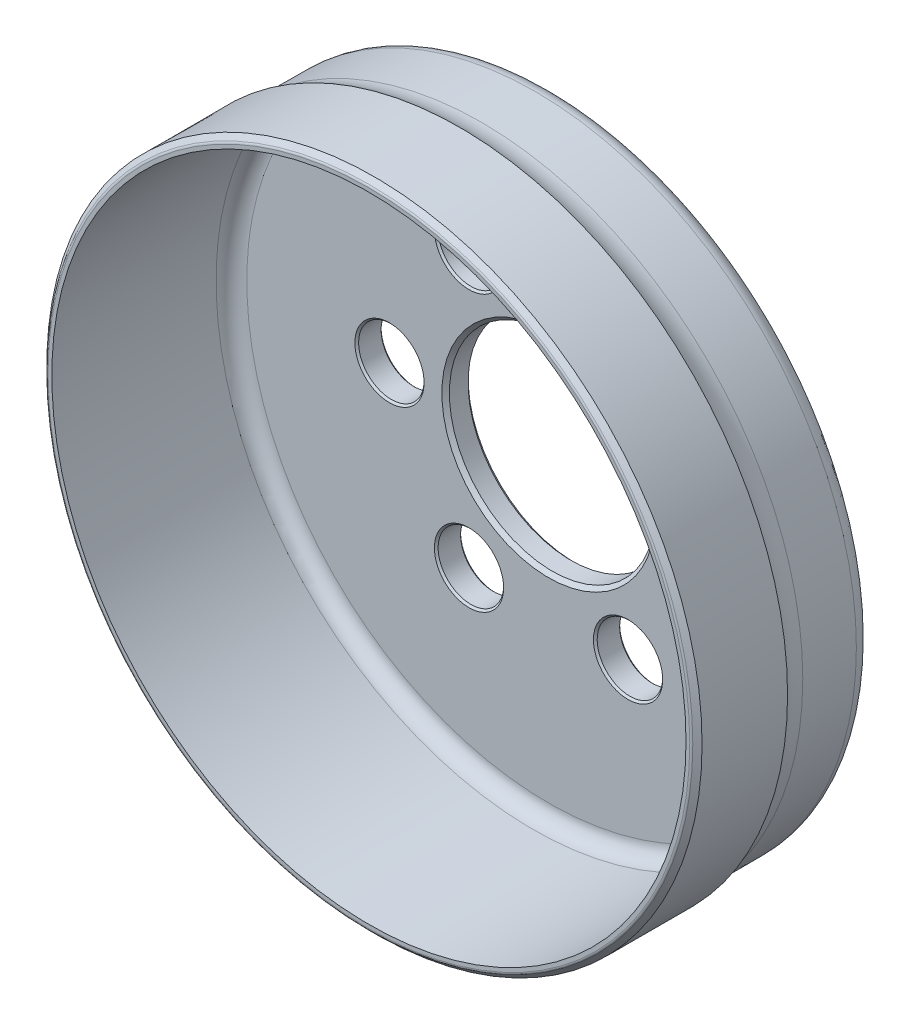
ISO-10303-21;
HEADER;
FILE_DESCRIPTION(('STEP AP214'),'2;1');
FILE_NAME('part.step','',(''),(''),'','','');
FILE_SCHEMA(('AUTOMOTIVE_DESIGN { 1 0 10303 214 1 1 1 1 }'));
ENDSEC;
DATA;
#1=APPLICATION_CONTEXT('core data for automotive mechanical design processes');
#2=APPLICATION_PROTOCOL_DEFINITION('international standard','automotive_design',2000,#1);
#3=PRODUCT_CONTEXT('',#1,'mechanical');
#4=PRODUCT('Part','Part','',(#3));
#5=PRODUCT_RELATED_PRODUCT_CATEGORY('part','',(#4));
#6=PRODUCT_DEFINITION_FORMATION('','',#4);
#7=PRODUCT_DEFINITION_CONTEXT('part definition',#1,'design');
#8=PRODUCT_DEFINITION('design','',#6,#7);
#9=PRODUCT_DEFINITION_SHAPE('','',#8);
#10=(LENGTH_UNIT() NAMED_UNIT(*) SI_UNIT(.MILLI.,.METRE.));
#11=(NAMED_UNIT(*) PLANE_ANGLE_UNIT() SI_UNIT($,.RADIAN.));
#12=(NAMED_UNIT(*) SI_UNIT($,.STERADIAN.) SOLID_ANGLE_UNIT());
#13=UNCERTAINTY_MEASURE_WITH_UNIT(LENGTH_MEASURE(1.E-05),#10,'distance_accuracy_value','');
#14=(GEOMETRIC_REPRESENTATION_CONTEXT(3) GLOBAL_UNCERTAINTY_ASSIGNED_CONTEXT((#13)) GLOBAL_UNIT_ASSIGNED_CONTEXT((#10,
#11,#12)) REPRESENTATION_CONTEXT('',''));
#15=CARTESIAN_POINT('',(0.,0.,0.));
#16=DIRECTION('',(0.,0.,1.));
#17=DIRECTION('',(1.,0.,0.));
#18=AXIS2_PLACEMENT_3D('',#15,#16,#17);
#19=CARTESIAN_POINT('',(4.25,-7.3612159321677,0.10000000000291));
#20=DIRECTION('',(0.,0.,-1.));
#21=DIRECTION('',(-0.5,0.866025403784439,0.));
#22=AXIS2_PLACEMENT_3D('',#19,#20,#21);
#23=CONICAL_SURFACE('',#22,1.75,0.785398162499991);
#24=CARTESIAN_POINT('',(4.25,-7.3612159321677,2.9072686986481E-12));
#25=DIRECTION('',(0.,0.,1.));
#26=DIRECTION('',(0.5,-0.866025403784439,0.));
#27=AXIS2_PLACEMENT_3D('',#24,#25,#26);
#28=CIRCLE('',#27,1.85);
#29=CARTESIAN_POINT('',(5.175,-8.9633629291689,2.9070773566175E-12));
#30=VERTEX_POINT('',#29);
#31=EDGE_CURVE('E258',#30,#30,#28,.T.);
#32=ORIENTED_EDGE('',*,*,#31,.F.);
#33=DIRECTION('',(-0.353553390593271,0.612372435695791,0.707106781186552));
#34=VECTOR('',#33,1.);
#35=CARTESIAN_POINT('',(5.175,-8.9633629291689,2.9070773566175E-12));
#36=LINE('',#35,#34);
#37=CARTESIAN_POINT('',(5.125,-8.8767603887905,0.10000000000291));
#38=VERTEX_POINT('',#37);
#39=EDGE_CURVE('E11',#30,#38,#36,.T.);
#40=ORIENTED_EDGE('',*,*,#39,.T.);
#41=CARTESIAN_POINT('',(4.25,-7.3612159321677,0.10000000000291));
#42=DIRECTION('',(0.,0.,1.));
#43=DIRECTION('',(0.5,-0.866025403784439,0.));
#44=AXIS2_PLACEMENT_3D('',#41,#42,#43);
#45=CIRCLE('',#44,1.75);
#46=EDGE_CURVE('E370',#38,#38,#45,.T.);
#47=ORIENTED_EDGE('',*,*,#46,.T.);
#48=ORIENTED_EDGE('',*,*,#39,.F.);
#49=EDGE_LOOP('',(#32,#40,#47,#48));
#50=FACE_BOUND('',#49,.T.);
#51=ADVANCED_FACE('F17',(#50),#23,.F.);
#52=CARTESIAN_POINT('',(-4.25,-7.3612159321677,0.1000000000029));
#53=DIRECTION('',(0.,0.,-1.));
#54=DIRECTION('',(0.5,0.866025403784439,0.));
#55=AXIS2_PLACEMENT_3D('',#52,#53,#54);
#56=CONICAL_SURFACE('',#55,1.75,0.785398162500023);
#57=CARTESIAN_POINT('',(-4.25,-7.3612159321677,2.9073045836436E-12));
#58=DIRECTION('',(0.,0.,1.));
#59=DIRECTION('',(-0.5,-0.866025403784439,0.));
#60=AXIS2_PLACEMENT_3D('',#57,#58,#59);
#61=CIRCLE('',#60,1.85);
#62=CARTESIAN_POINT('',(-5.175,-8.9633629291689,2.9070773566175E-12));
#63=VERTEX_POINT('',#62);
#64=EDGE_CURVE('E254',#63,#63,#61,.T.);
#65=ORIENTED_EDGE('',*,*,#64,.F.);
#66=DIRECTION('',(0.353553390593271,0.612372435695791,0.707106781186552));
#67=VECTOR('',#66,1.);
#68=CARTESIAN_POINT('',(-5.175,-8.9633629291689,2.9070773566175E-12));
#69=LINE('',#68,#67);
#70=CARTESIAN_POINT('',(-5.125,-8.8767603887905,0.10000000000291));
#71=VERTEX_POINT('',#70);
#72=EDGE_CURVE('E25',#63,#71,#69,.T.);
#73=ORIENTED_EDGE('',*,*,#72,.T.);
#74=CARTESIAN_POINT('',(-4.25,-7.3612159321677,0.10000000000291));
#75=DIRECTION('',(0.,0.,1.));
#76=DIRECTION('',(-0.5,-0.866025403784439,0.));
#77=AXIS2_PLACEMENT_3D('',#74,#75,#76);
#78=CIRCLE('',#77,1.75);
#79=EDGE_CURVE('E279',#71,#71,#78,.T.);
#80=ORIENTED_EDGE('',*,*,#79,.T.);
#81=ORIENTED_EDGE('',*,*,#72,.F.);
#82=EDGE_LOOP('',(#65,#73,#80,#81));
#83=FACE_BOUND('',#82,.T.);
#84=ADVANCED_FACE('F453',(#83),#56,.F.);
#85=CARTESIAN_POINT('',(-8.5,0.,0.10000000000291));
#86=DIRECTION('',(0.,0.,-1.));
#87=DIRECTION('',(1.,0.,0.));
#88=AXIS2_PLACEMENT_3D('',#85,#86,#87);
#89=CONICAL_SURFACE('',#88,1.75,0.785398162499991);
#90=CARTESIAN_POINT('',(-8.5,0.,2.9072907058558E-12));
#91=DIRECTION('',(0.,0.,1.));
#92=DIRECTION('',(-1.,0.,0.));
#93=AXIS2_PLACEMENT_3D('',#90,#91,#92);
#94=CIRCLE('',#93,1.85);
#95=CARTESIAN_POINT('',(-10.35,0.,2.9070773566175E-12));
#96=VERTEX_POINT('',#95);
#97=EDGE_CURVE('E259',#96,#96,#94,.T.);
#98=ORIENTED_EDGE('',*,*,#97,.F.);
#99=DIRECTION('',(0.707106781186548,0.,0.707106781186548));
#100=VECTOR('',#99,1.);
#101=CARTESIAN_POINT('',(-10.35,0.,2.9070773566175E-12));
#102=LINE('',#101,#100);
#103=CARTESIAN_POINT('',(-10.25,0.,0.10000000000291));
#104=VERTEX_POINT('',#103);
#105=EDGE_CURVE('E388',#96,#104,#102,.T.);
#106=ORIENTED_EDGE('',*,*,#105,.T.);
#107=CARTESIAN_POINT('',(-8.5,0.,0.10000000000291));
#108=DIRECTION('',(0.,0.,1.));
#109=DIRECTION('',(-1.,0.,0.));
#110=AXIS2_PLACEMENT_3D('',#107,#108,#109);
#111=CIRCLE('',#110,1.75);
#112=EDGE_CURVE('E314',#104,#104,#111,.T.);
#113=ORIENTED_EDGE('',*,*,#112,.T.);
#114=ORIENTED_EDGE('',*,*,#105,.F.);
#115=EDGE_LOOP('',(#98,#106,#113,#114));
#116=FACE_BOUND('',#115,.T.);
#117=ADVANCED_FACE('F458',(#116),#89,.F.);
#118=CARTESIAN_POINT('',(-4.25,7.3612159321677,0.1000000000029));
#119=DIRECTION('',(0.,0.,-1.));
#120=DIRECTION('',(0.5,-0.866025403784439,0.));
#121=AXIS2_PLACEMENT_3D('',#118,#119,#120);
#122=CONICAL_SURFACE('',#121,1.75,0.785398162500023);
#123=CARTESIAN_POINT('',(-4.25,7.3612159321677,2.9072849574879E-12));
#124=DIRECTION('',(0.,0.,1.));
#125=DIRECTION('',(-0.5,0.866025403784439,0.));
#126=AXIS2_PLACEMENT_3D('',#123,#124,#125);
#127=CIRCLE('',#126,1.85);
#128=CARTESIAN_POINT('',(-5.175,8.9633629291689,2.9070773566175E-12));
#129=VERTEX_POINT('',#128);
#130=EDGE_CURVE('E336',#129,#129,#127,.T.);
#131=ORIENTED_EDGE('',*,*,#130,.F.);
#132=DIRECTION('',(0.353553390593271,-0.612372435695791,0.707106781186552));
#133=VECTOR('',#132,1.);
#134=CARTESIAN_POINT('',(-5.175,8.9633629291689,2.9070773566175E-12));
#135=LINE('',#134,#133);
#136=CARTESIAN_POINT('',(-5.125,8.8767603887905,0.10000000000291));
#137=VERTEX_POINT('',#136);
#138=EDGE_CURVE('E296',#129,#137,#135,.T.);
#139=ORIENTED_EDGE('',*,*,#138,.T.);
#140=CARTESIAN_POINT('',(-4.25,7.3612159321677,0.10000000000291));
#141=DIRECTION('',(0.,0.,1.));
#142=DIRECTION('',(-0.5,0.866025403784439,0.));
#143=AXIS2_PLACEMENT_3D('',#140,#141,#142);
#144=CIRCLE('',#143,1.75);
#145=EDGE_CURVE('E229',#137,#137,#144,.T.);
#146=ORIENTED_EDGE('',*,*,#145,.T.);
#147=ORIENTED_EDGE('',*,*,#138,.F.);
#148=EDGE_LOOP('',(#131,#139,#146,#147));
#149=FACE_BOUND('',#148,.T.);
#150=ADVANCED_FACE('F612',(#149),#122,.F.);
#151=CARTESIAN_POINT('',(4.25,7.3612159321677,0.10000000000291));
#152=DIRECTION('',(0.,0.,-1.));
#153=DIRECTION('',(-0.5,-0.866025403784439,0.));
#154=AXIS2_PLACEMENT_3D('',#151,#152,#153);
#155=CONICAL_SURFACE('',#154,1.75,0.785398162499982);
#156=CARTESIAN_POINT('',(4.25,7.3612159321677,2.9073045836436E-12));
#157=DIRECTION('',(0.,0.,1.));
#158=DIRECTION('',(0.5,0.866025403784439,0.));
#159=AXIS2_PLACEMENT_3D('',#156,#157,#158);
#160=CIRCLE('',#159,1.85);
#161=CARTESIAN_POINT('',(5.175,8.9633629291689,2.9070773566175E-12));
#162=VERTEX_POINT('',#161);
#163=EDGE_CURVE('E332',#162,#162,#160,.T.);
#164=ORIENTED_EDGE('',*,*,#163,.F.);
#165=DIRECTION('',(-0.353553390593271,-0.612372435695791,0.707106781186552));
#166=VECTOR('',#165,1.);
#167=CARTESIAN_POINT('',(5.175,8.9633629291689,2.9070773566175E-12));
#168=LINE('',#167,#166);
#169=CARTESIAN_POINT('',(5.125,8.8767603887905,0.10000000000291));
#170=VERTEX_POINT('',#169);
#171=EDGE_CURVE('E293',#162,#170,#168,.T.);
#172=ORIENTED_EDGE('',*,*,#171,.T.);
#173=CARTESIAN_POINT('',(4.25,7.3612159321677,0.10000000000291));
#174=DIRECTION('',(0.,0.,1.));
#175=DIRECTION('',(0.5,0.866025403784439,0.));
#176=AXIS2_PLACEMENT_3D('',#173,#174,#175);
#177=CIRCLE('',#176,1.75);
#178=EDGE_CURVE('E264',#170,#170,#177,.T.);
#179=ORIENTED_EDGE('',*,*,#178,.T.);
#180=ORIENTED_EDGE('',*,*,#171,.F.);
#181=EDGE_LOOP('',(#164,#172,#179,#180));
#182=FACE_BOUND('',#181,.T.);
#183=ADVANCED_FACE('F610',(#182),#155,.F.);
#184=CARTESIAN_POINT('',(8.5,0.,0.10000000000291));
#185=DIRECTION('',(0.,0.,-1.));
#186=DIRECTION('',(-1.,0.,0.));
#187=AXIS2_PLACEMENT_3D('',#184,#185,#186);
#188=CONICAL_SURFACE('',#187,1.75,0.785398162499991);
#189=CARTESIAN_POINT('',(8.5,0.,2.9072907058558E-12));
#190=DIRECTION('',(0.,0.,1.));
#191=DIRECTION('',(1.,0.,0.));
#192=AXIS2_PLACEMENT_3D('',#189,#190,#191);
#193=CIRCLE('',#192,1.85);
#194=CARTESIAN_POINT('',(10.35,0.,2.9070773566175E-12));
#195=VERTEX_POINT('',#194);
#196=EDGE_CURVE('E278',#195,#195,#193,.T.);
#197=ORIENTED_EDGE('',*,*,#196,.F.);
#198=DIRECTION('',(-0.707106781186548,0.,0.707106781186548));
#199=VECTOR('',#198,1.);
#200=CARTESIAN_POINT('',(10.35,0.,2.9070773566175E-12));
#201=LINE('',#200,#199);
#202=CARTESIAN_POINT('',(10.25,0.,0.10000000000291));
#203=VERTEX_POINT('',#202);
#204=EDGE_CURVE('E297',#195,#203,#201,.T.);
#205=ORIENTED_EDGE('',*,*,#204,.T.);
#206=CARTESIAN_POINT('',(8.5,0.,0.10000000000291));
#207=DIRECTION('',(0.,0.,1.));
#208=DIRECTION('',(1.,0.,0.));
#209=AXIS2_PLACEMENT_3D('',#206,#207,#208);
#210=CIRCLE('',#209,1.75);
#211=EDGE_CURVE('E286',#203,#203,#210,.T.);
#212=ORIENTED_EDGE('',*,*,#211,.T.);
#213=ORIENTED_EDGE('',*,*,#204,.F.);
#214=EDGE_LOOP('',(#197,#205,#212,#213));
#215=FACE_BOUND('',#214,.T.);
#216=ADVANCED_FACE('F474',(#215),#188,.F.);
#217=CARTESIAN_POINT('',(4.25,-7.3612159321677,1.2999999999971));
#218=DIRECTION('',(0.,0.,1.));
#219=DIRECTION('',(-0.5,0.866025403784439,0.));
#220=AXIS2_PLACEMENT_3D('',#217,#218,#219);
#221=CONICAL_SURFACE('',#220,1.75,0.785398162499982);
#222=DIRECTION('',(0.353553390593271,-0.612372435695791,0.707106781186552));
#223=VECTOR('',#222,1.);
#224=CARTESIAN_POINT('',(5.125,-8.8767603887905,1.2999999999971));
#225=LINE('',#224,#223);
#226=CARTESIAN_POINT('',(5.125,-8.8767603887905,1.2999999999971));
#227=VERTEX_POINT('',#226);
#228=CARTESIAN_POINT('',(5.175,-8.9633629291689,1.3999999999971));
#229=VERTEX_POINT('',#228);
#230=EDGE_CURVE('E44',#227,#229,#225,.T.);
#231=ORIENTED_EDGE('',*,*,#230,.F.);
#232=CARTESIAN_POINT('',(4.25,-7.3612159321677,1.2999999999971));
#233=DIRECTION('',(0.,0.,1.));
#234=DIRECTION('',(0.5,-0.866025403784439,0.));
#235=AXIS2_PLACEMENT_3D('',#232,#233,#234);
#236=CIRCLE('',#235,1.75);
#237=EDGE_CURVE('E371',#227,#227,#236,.T.);
#238=ORIENTED_EDGE('',*,*,#237,.F.);
#239=ORIENTED_EDGE('',*,*,#230,.T.);
#240=CARTESIAN_POINT('',(4.25,-7.3612159321677,1.3999999999971));
#241=DIRECTION('',(0.,0.,1.));
#242=DIRECTION('',(0.5,-0.866025403784439,0.));
#243=AXIS2_PLACEMENT_3D('',#240,#241,#242);
#244=CIRCLE('',#243,1.85);
#245=EDGE_CURVE('E363',#229,#229,#244,.T.);
#246=ORIENTED_EDGE('',*,*,#245,.T.);
#247=EDGE_LOOP('',(#231,#238,#239,#246));
#248=FACE_BOUND('',#247,.T.);
#249=ADVANCED_FACE('F592',(#248),#221,.F.);
#250=CARTESIAN_POINT('',(-4.25,-7.3612159321677,1.2999999999971));
#251=DIRECTION('',(0.,0.,1.));
#252=DIRECTION('',(0.5,0.866025403784439,0.));
#253=AXIS2_PLACEMENT_3D('',#250,#251,#252);
#254=CONICAL_SURFACE('',#253,1.75,0.785398162500012);
#255=DIRECTION('',(-0.353553390593271,-0.612372435695791,0.707106781186552));
#256=VECTOR('',#255,1.);
#257=CARTESIAN_POINT('',(-5.125,-8.8767603887905,1.2999999999971));
#258=LINE('',#257,#256);
#259=CARTESIAN_POINT('',(-5.125,-8.8767603887905,1.2999999999971));
#260=VERTEX_POINT('',#259);
#261=CARTESIAN_POINT('',(-5.175,-8.9633629291689,1.3999999999971));
#262=VERTEX_POINT('',#261);
#263=EDGE_CURVE('E382',#260,#262,#258,.T.);
#264=ORIENTED_EDGE('',*,*,#263,.F.);
#265=CARTESIAN_POINT('',(-4.25,-7.3612159321677,1.2999999999971));
#266=DIRECTION('',(0.,0.,1.));
#267=DIRECTION('',(-0.5,-0.866025403784439,0.));
#268=AXIS2_PLACEMENT_3D('',#265,#266,#267);
#269=CIRCLE('',#268,1.75);
#270=EDGE_CURVE('E274',#260,#260,#269,.T.);
#271=ORIENTED_EDGE('',*,*,#270,.F.);
#272=ORIENTED_EDGE('',*,*,#263,.T.);
#273=CARTESIAN_POINT('',(-4.25,-7.3612159321677,1.3999999999971));
#274=DIRECTION('',(0.,0.,1.));
#275=DIRECTION('',(-0.5,-0.866025403784439,0.));
#276=AXIS2_PLACEMENT_3D('',#273,#274,#275);
#277=CIRCLE('',#276,1.85);
#278=EDGE_CURVE('E359',#262,#262,#277,.T.);
#279=ORIENTED_EDGE('',*,*,#278,.T.);
#280=EDGE_LOOP('',(#264,#271,#272,#279));
#281=FACE_BOUND('',#280,.T.);
#282=ADVANCED_FACE('F638',(#281),#254,.F.);
#283=CARTESIAN_POINT('',(-8.5,0.,1.2999999999971));
#284=DIRECTION('',(0.,0.,1.));
#285=DIRECTION('',(1.,0.,0.));
#286=AXIS2_PLACEMENT_3D('',#283,#284,#285);
#287=CONICAL_SURFACE('',#286,1.75,0.785398162499982);
#288=DIRECTION('',(-0.707106781186548,0.,0.707106781186548));
#289=VECTOR('',#288,1.);
#290=CARTESIAN_POINT('',(-10.25,0.,1.2999999999971));
#291=LINE('',#290,#289);
#292=CARTESIAN_POINT('',(-10.25,0.,1.2999999999971));
#293=VERTEX_POINT('',#292);
#294=CARTESIAN_POINT('',(-10.35,0.,1.3999999999971));
#295=VERTEX_POINT('',#294);
#296=EDGE_CURVE('E379',#293,#295,#291,.T.);
#297=ORIENTED_EDGE('',*,*,#296,.F.);
#298=CARTESIAN_POINT('',(-8.5,0.,1.2999999999971));
#299=DIRECTION('',(0.,0.,1.));
#300=DIRECTION('',(-1.,0.,0.));
#301=AXIS2_PLACEMENT_3D('',#298,#299,#300);
#302=CIRCLE('',#301,1.75);
#303=EDGE_CURVE('E318',#293,#293,#302,.T.);
#304=ORIENTED_EDGE('',*,*,#303,.F.);
#305=ORIENTED_EDGE('',*,*,#296,.T.);
#306=CARTESIAN_POINT('',(-8.5,0.,1.3999999999971));
#307=DIRECTION('',(0.,0.,1.));
#308=DIRECTION('',(-1.,0.,0.));
#309=AXIS2_PLACEMENT_3D('',#306,#307,#308);
#310=CIRCLE('',#309,1.85);
#311=EDGE_CURVE('E355',#295,#295,#310,.T.);
#312=ORIENTED_EDGE('',*,*,#311,.T.);
#313=EDGE_LOOP('',(#297,#304,#305,#312));
#314=FACE_BOUND('',#313,.T.);
#315=ADVANCED_FACE('F635',(#314),#287,.F.);
#316=CARTESIAN_POINT('',(-4.25,7.3612159321677,1.2999999999971));
#317=DIRECTION('',(0.,0.,1.));
#318=DIRECTION('',(0.5,-0.866025403784439,0.));
#319=AXIS2_PLACEMENT_3D('',#316,#317,#318);
#320=CONICAL_SURFACE('',#319,1.75,0.785398162500012);
#321=DIRECTION('',(-0.353553390593271,0.612372435695791,0.707106781186552));
#322=VECTOR('',#321,1.);
#323=CARTESIAN_POINT('',(-5.125,8.8767603887905,1.2999999999971));
#324=LINE('',#323,#322);
#325=CARTESIAN_POINT('',(-5.125,8.8767603887905,1.2999999999971));
#326=VERTEX_POINT('',#325);
#327=CARTESIAN_POINT('',(-5.175,8.9633629291689,1.3999999999971));
#328=VERTEX_POINT('',#327);
#329=EDGE_CURVE('E378',#326,#328,#324,.T.);
#330=ORIENTED_EDGE('',*,*,#329,.F.);
#331=CARTESIAN_POINT('',(-4.25,7.3612159321677,1.2999999999971));
#332=DIRECTION('',(0.,0.,1.));
#333=DIRECTION('',(-0.5,0.866025403784439,0.));
#334=AXIS2_PLACEMENT_3D('',#331,#332,#333);
#335=CIRCLE('',#334,1.75);
#336=EDGE_CURVE('E306',#326,#326,#335,.T.);
#337=ORIENTED_EDGE('',*,*,#336,.F.);
#338=ORIENTED_EDGE('',*,*,#329,.T.);
#339=CARTESIAN_POINT('',(-4.25,7.3612159321677,1.3999999999971));
#340=DIRECTION('',(0.,0.,1.));
#341=DIRECTION('',(-0.5,0.866025403784439,0.));
#342=AXIS2_PLACEMENT_3D('',#339,#340,#341);
#343=CIRCLE('',#342,1.85);
#344=EDGE_CURVE('E351',#328,#328,#343,.T.);
#345=ORIENTED_EDGE('',*,*,#344,.T.);
#346=EDGE_LOOP('',(#330,#337,#338,#345));
#347=FACE_BOUND('',#346,.T.);
#348=ADVANCED_FACE('F637',(#347),#320,.F.);
#349=CARTESIAN_POINT('',(4.25,7.3612159321677,1.2999999999971));
#350=DIRECTION('',(0.,0.,1.));
#351=DIRECTION('',(-0.5,-0.866025403784439,0.));
#352=AXIS2_PLACEMENT_3D('',#349,#350,#351);
#353=CONICAL_SURFACE('',#352,1.75,0.785398162499972);
#354=DIRECTION('',(0.353553390593271,0.612372435695791,0.707106781186552));
#355=VECTOR('',#354,1.);
#356=CARTESIAN_POINT('',(5.125,8.8767603887905,1.2999999999971));
#357=LINE('',#356,#355);
#358=CARTESIAN_POINT('',(5.125,8.8767603887905,1.2999999999971));
#359=VERTEX_POINT('',#358);
#360=CARTESIAN_POINT('',(5.175,8.9633629291689,1.3999999999971));
#361=VERTEX_POINT('',#360);
#362=EDGE_CURVE('E375',#359,#361,#357,.T.);
#363=ORIENTED_EDGE('',*,*,#362,.F.);
#364=CARTESIAN_POINT('',(4.25,7.3612159321677,1.2999999999971));
#365=DIRECTION('',(0.,0.,1.));
#366=DIRECTION('',(0.5,0.866025403784439,0.));
#367=AXIS2_PLACEMENT_3D('',#364,#365,#366);
#368=CIRCLE('',#367,1.75);
#369=EDGE_CURVE('E301',#359,#359,#368,.T.);
#370=ORIENTED_EDGE('',*,*,#369,.F.);
#371=ORIENTED_EDGE('',*,*,#362,.T.);
#372=CARTESIAN_POINT('',(4.25,7.3612159321677,1.3999999999971));
#373=DIRECTION('',(0.,0.,1.));
#374=DIRECTION('',(0.5,0.866025403784439,0.));
#375=AXIS2_PLACEMENT_3D('',#372,#373,#374);
#376=CIRCLE('',#375,1.85);
#377=EDGE_CURVE('E347',#361,#361,#376,.T.);
#378=ORIENTED_EDGE('',*,*,#377,.T.);
#379=EDGE_LOOP('',(#363,#370,#371,#378));
#380=FACE_BOUND('',#379,.T.);
#381=ADVANCED_FACE('F603',(#380),#353,.F.);
#382=CARTESIAN_POINT('',(8.5,0.,1.2999999999971));
#383=DIRECTION('',(0.,0.,1.));
#384=DIRECTION('',(-1.,0.,0.));
#385=AXIS2_PLACEMENT_3D('',#382,#383,#384);
#386=CONICAL_SURFACE('',#385,1.75,0.785398162499982);
#387=DIRECTION('',(0.707106781186548,0.,0.707106781186548));
#388=VECTOR('',#387,1.);
#389=CARTESIAN_POINT('',(10.25,0.,1.2999999999971));
#390=LINE('',#389,#388);
#391=CARTESIAN_POINT('',(10.25,0.,1.2999999999971));
#392=VERTEX_POINT('',#391);
#393=CARTESIAN_POINT('',(10.35,0.,1.3999999999971));
#394=VERTEX_POINT('',#393);
#395=EDGE_CURVE('E374',#392,#394,#390,.T.);
#396=ORIENTED_EDGE('',*,*,#395,.F.);
#397=CARTESIAN_POINT('',(8.5,0.,1.2999999999971));
#398=DIRECTION('',(0.,0.,1.));
#399=DIRECTION('',(1.,0.,0.));
#400=AXIS2_PLACEMENT_3D('',#397,#398,#399);
#401=CIRCLE('',#400,1.75);
#402=EDGE_CURVE('E265',#392,#392,#401,.T.);
#403=ORIENTED_EDGE('',*,*,#402,.F.);
#404=ORIENTED_EDGE('',*,*,#395,.T.);
#405=CARTESIAN_POINT('',(8.5,0.,1.3999999999971));
#406=DIRECTION('',(0.,0.,1.));
#407=DIRECTION('',(1.,0.,0.));
#408=AXIS2_PLACEMENT_3D('',#405,#406,#407);
#409=CIRCLE('',#408,1.85);
#410=EDGE_CURVE('E343',#394,#394,#409,.T.);
#411=ORIENTED_EDGE('',*,*,#410,.T.);
#412=EDGE_LOOP('',(#396,#403,#404,#411));
#413=FACE_BOUND('',#412,.T.);
#414=ADVANCED_FACE('F481',(#413),#386,.F.);
#415=CARTESIAN_POINT('',(4.25,-7.3612159321677,1.3999999999971));
#416=DIRECTION('',(0.,0.,-1.));
#417=DIRECTION('',(-0.5,0.866025403784439,0.));
#418=AXIS2_PLACEMENT_3D('',#415,#416,#417);
#419=CYLINDRICAL_SURFACE('',#418,1.75);
#420=DIRECTION('',(0.,0.,-1.));
#421=VECTOR('',#420,1.);
#422=CARTESIAN_POINT('',(5.125,-8.8767603887905,1.2999999999971));
#423=LINE('',#422,#421);
#424=EDGE_CURVE('E366',#227,#38,#423,.T.);
#425=ORIENTED_EDGE('',*,*,#424,.T.);
#426=ORIENTED_EDGE('',*,*,#46,.F.);
#427=ORIENTED_EDGE('',*,*,#424,.F.);
#428=ORIENTED_EDGE('',*,*,#237,.T.);
#429=EDGE_LOOP('',(#425,#426,#427,#428));
#430=FACE_BOUND('',#429,.T.);
#431=ADVANCED_FACE('F486',(#430),#419,.F.);
#432=CARTESIAN_POINT('',(0.,0.,1.3999999999971));
#433=DIRECTION('',(0.,0.,1.));
#434=DIRECTION('',(1.,0.,0.));
#435=AXIS2_PLACEMENT_3D('',#432,#433,#434);
#436=PLANE('',#435);
#437=ORIENTED_EDGE('',*,*,#245,.F.);
#438=EDGE_LOOP('',(#437));
#439=FACE_BOUND('',#438,.T.);
#440=ORIENTED_EDGE('',*,*,#278,.F.);
#441=EDGE_LOOP('',(#440));
#442=FACE_BOUND('',#441,.T.);
#443=ORIENTED_EDGE('',*,*,#311,.F.);
#444=EDGE_LOOP('',(#443));
#445=FACE_BOUND('',#444,.T.);
#446=ORIENTED_EDGE('',*,*,#344,.F.);
#447=EDGE_LOOP('',(#446));
#448=FACE_BOUND('',#447,.T.);
#449=ORIENTED_EDGE('',*,*,#377,.F.);
#450=EDGE_LOOP('',(#449));
#451=FACE_BOUND('',#450,.T.);
#452=ORIENTED_EDGE('',*,*,#410,.F.);
#453=EDGE_LOOP('',(#452));
#454=FACE_BOUND('',#453,.T.);
#455=CARTESIAN_POINT('',(0.,0.,1.3999999999971));
#456=DIRECTION('',(0.,0.,1.));
#457=DIRECTION('',(1.,0.,0.));
#458=AXIS2_PLACEMENT_3D('',#455,#456,#457);
#459=CIRCLE('',#458,5.6999999999998);
#460=CARTESIAN_POINT('',(5.6999999999998,0.,1.3999999999971));
#461=VERTEX_POINT('',#460);
#462=EDGE_CURVE('E273',#461,#461,#459,.T.);
#463=ORIENTED_EDGE('',*,*,#462,.F.);
#464=EDGE_LOOP('',(#463));
#465=FACE_BOUND('',#464,.T.);
#466=CARTESIAN_POINT('',(0.,0.,1.3999999999971));
#467=DIRECTION('',(0.,0.,1.));
#468=DIRECTION('',(1.,0.,0.));
#469=AXIS2_PLACEMENT_3D('',#466,#467,#468);
#470=CIRCLE('',#469,16.127999999806);
#471=CARTESIAN_POINT('',(16.128000000297,0.,1.4000000000007));
#472=VERTEX_POINT('',#471);
#473=EDGE_CURVE('E492',#472,#472,#470,.T.);
#474=ORIENTED_EDGE('',*,*,#473,.T.);
#475=EDGE_LOOP('',(#474));
#476=FACE_BOUND('',#475,.T.);
#477=ADVANCED_FACE('F463',(#439,#442,#445,#448,#451,#454,#465,#476),#436,.T.);
#478=CARTESIAN_POINT('',(0.,0.,2.9082628604278E-12));
#479=DIRECTION('',(0.,0.,-1.));
#480=DIRECTION('',(0.,-1.,0.));
#481=AXIS2_PLACEMENT_3D('',#478,#479,#480);
#482=PLANE('',#481);
#483=ORIENTED_EDGE('',*,*,#31,.T.);
#484=EDGE_LOOP('',(#483));
#485=FACE_BOUND('',#484,.T.);
#486=ORIENTED_EDGE('',*,*,#64,.T.);
#487=EDGE_LOOP('',(#486));
#488=FACE_BOUND('',#487,.T.);
#489=ORIENTED_EDGE('',*,*,#97,.T.);
#490=EDGE_LOOP('',(#489));
#491=FACE_BOUND('',#490,.T.);
#492=ORIENTED_EDGE('',*,*,#130,.T.);
#493=EDGE_LOOP('',(#492));
#494=FACE_BOUND('',#493,.T.);
#495=ORIENTED_EDGE('',*,*,#163,.T.);
#496=EDGE_LOOP('',(#495));
#497=FACE_BOUND('',#496,.T.);
#498=ORIENTED_EDGE('',*,*,#196,.T.);
#499=EDGE_LOOP('',(#498));
#500=FACE_BOUND('',#499,.T.);
#501=CARTESIAN_POINT('',(0.,0.,2.9092915637391E-12));
#502=DIRECTION('',(0.,0.,1.));
#503=DIRECTION('',(1.,0.,0.));
#504=AXIS2_PLACEMENT_3D('',#501,#502,#503);
#505=CIRCLE('',#504,5.6999999999998);
#506=CARTESIAN_POINT('',(5.6999999999998,0.,2.9092915637391E-12));
#507=VERTEX_POINT('',#506);
#508=EDGE_CURVE('E206',#507,#507,#505,.T.);
#509=ORIENTED_EDGE('',*,*,#508,.T.);
#510=EDGE_LOOP('',(#509));
#511=FACE_BOUND('',#510,.T.);
#512=CARTESIAN_POINT('',(0.,0.,2.9082628604278E-12));
#513=DIRECTION('',(0.,0.,1.));
#514=DIRECTION('',(1.,0.,0.));
#515=AXIS2_PLACEMENT_3D('',#512,#513,#514);
#516=CIRCLE('',#515,11.3);
#517=CARTESIAN_POINT('',(11.3,0.,2.9082628604278E-12));
#518=VERTEX_POINT('',#517);
#519=EDGE_CURVE('E249',#518,#518,#516,.T.);
#520=ORIENTED_EDGE('',*,*,#519,.F.);
#521=EDGE_LOOP('',(#520));
#522=FACE_BOUND('',#521,.T.);
#523=ADVANCED_FACE('F207',(#485,#488,#491,#494,#497,#500,#511,#522),#482,.T.);
#524=CARTESIAN_POINT('',(-4.25,-7.3612159321677,1.3999999999971));
#525=DIRECTION('',(0.,0.,-1.));
#526=DIRECTION('',(0.5,0.866025403784439,0.));
#527=AXIS2_PLACEMENT_3D('',#524,#525,#526);
#528=CYLINDRICAL_SURFACE('',#527,1.75);
#529=DIRECTION('',(0.,0.,-1.));
#530=VECTOR('',#529,1.);
#531=CARTESIAN_POINT('',(-5.125,-8.8767603887905,1.2999999999971));
#532=LINE('',#531,#530);
#533=EDGE_CURVE('E322',#260,#71,#532,.T.);
#534=ORIENTED_EDGE('',*,*,#533,.T.);
#535=ORIENTED_EDGE('',*,*,#79,.F.);
#536=ORIENTED_EDGE('',*,*,#533,.F.);
#537=ORIENTED_EDGE('',*,*,#270,.T.);
#538=EDGE_LOOP('',(#534,#535,#536,#537));
#539=FACE_BOUND('',#538,.T.);
#540=ADVANCED_FACE('F462',(#539),#528,.F.);
#541=CARTESIAN_POINT('',(-8.5,0.,1.3999999999971));
#542=DIRECTION('',(0.,0.,-1.));
#543=DIRECTION('',(1.,0.,0.));
#544=AXIS2_PLACEMENT_3D('',#541,#542,#543);
#545=CYLINDRICAL_SURFACE('',#544,1.75);
#546=DIRECTION('',(0.,0.,-1.));
#547=VECTOR('',#546,1.);
#548=CARTESIAN_POINT('',(-10.25,0.,1.2999999999971));
#549=LINE('',#548,#547);
#550=EDGE_CURVE('E310',#293,#104,#549,.T.);
#551=ORIENTED_EDGE('',*,*,#550,.T.);
#552=ORIENTED_EDGE('',*,*,#112,.F.);
#553=ORIENTED_EDGE('',*,*,#550,.F.);
#554=ORIENTED_EDGE('',*,*,#303,.T.);
#555=EDGE_LOOP('',(#551,#552,#553,#554));
#556=FACE_BOUND('',#555,.T.);
#557=ADVANCED_FACE('F632',(#556),#545,.F.);
#558=CARTESIAN_POINT('',(-4.25,7.3612159321677,1.3999999999971));
#559=DIRECTION('',(0.,0.,-1.));
#560=DIRECTION('',(0.5,-0.866025403784439,0.));
#561=AXIS2_PLACEMENT_3D('',#558,#559,#560);
#562=CYLINDRICAL_SURFACE('',#561,1.75);
#563=DIRECTION('',(0.,0.,-1.));
#564=VECTOR('',#563,1.);
#565=CARTESIAN_POINT('',(-5.125,8.8767603887905,1.2999999999971));
#566=LINE('',#565,#564);
#567=EDGE_CURVE('E302',#326,#137,#566,.T.);
#568=ORIENTED_EDGE('',*,*,#567,.T.);
#569=ORIENTED_EDGE('',*,*,#145,.F.);
#570=ORIENTED_EDGE('',*,*,#567,.F.);
#571=ORIENTED_EDGE('',*,*,#336,.T.);
#572=EDGE_LOOP('',(#568,#569,#570,#571));
#573=FACE_BOUND('',#572,.T.);
#574=ADVANCED_FACE('F658',(#573),#562,.F.);
#575=CARTESIAN_POINT('',(4.25,7.3612159321677,1.3999999999971));
#576=DIRECTION('',(0.,0.,-1.));
#577=DIRECTION('',(-0.5,-0.866025403784439,0.));
#578=AXIS2_PLACEMENT_3D('',#575,#576,#577);
#579=CYLINDRICAL_SURFACE('',#578,1.75);
#580=DIRECTION('',(0.,0.,-1.));
#581=VECTOR('',#580,1.);
#582=CARTESIAN_POINT('',(5.125,8.8767603887905,1.2999999999971));
#583=LINE('',#582,#581);
#584=EDGE_CURVE('E260',#359,#170,#583,.T.);
#585=ORIENTED_EDGE('',*,*,#584,.T.);
#586=ORIENTED_EDGE('',*,*,#178,.F.);
#587=ORIENTED_EDGE('',*,*,#584,.F.);
#588=ORIENTED_EDGE('',*,*,#369,.T.);
#589=EDGE_LOOP('',(#585,#586,#587,#588));
#590=FACE_BOUND('',#589,.T.);
#591=ADVANCED_FACE('F608',(#590),#579,.F.);
#592=CARTESIAN_POINT('',(8.5,0.,1.3999999999971));
#593=DIRECTION('',(0.,0.,-1.));
#594=DIRECTION('',(-1.,0.,0.));
#595=AXIS2_PLACEMENT_3D('',#592,#593,#594);
#596=CYLINDRICAL_SURFACE('',#595,1.75);
#597=DIRECTION('',(0.,0.,-1.));
#598=VECTOR('',#597,1.);
#599=CARTESIAN_POINT('',(10.25,0.,1.2999999999971));
#600=LINE('',#599,#598);
#601=EDGE_CURVE('E282',#392,#203,#600,.T.);
#602=ORIENTED_EDGE('',*,*,#601,.T.);
#603=ORIENTED_EDGE('',*,*,#211,.F.);
#604=ORIENTED_EDGE('',*,*,#601,.F.);
#605=ORIENTED_EDGE('',*,*,#402,.T.);
#606=EDGE_LOOP('',(#602,#603,#604,#605));
#607=FACE_BOUND('',#606,.T.);
#608=ADVANCED_FACE('F478',(#607),#596,.F.);
#609=CARTESIAN_POINT('',(0.,0.,1.2));
#610=DIRECTION('',(0.,0.,1.));
#611=DIRECTION('',(-1.,0.,0.));
#612=AXIS2_PLACEMENT_3D('',#609,#610,#611);
#613=CONICAL_SURFACE('',#612,5.5,0.785398162506823);
#614=DIRECTION('',(0.707106781191373,0.,0.707106781181723));
#615=VECTOR('',#614,1.);
#616=CARTESIAN_POINT('',(5.5,0.,1.2));
#617=LINE('',#616,#615);
#618=CARTESIAN_POINT('',(5.5,0.,1.2));
#619=VERTEX_POINT('',#618);
#620=EDGE_CURVE('E269',#619,#461,#617,.T.);
#621=ORIENTED_EDGE('',*,*,#620,.T.);
#622=ORIENTED_EDGE('',*,*,#462,.T.);
#623=ORIENTED_EDGE('',*,*,#620,.F.);
#624=CARTESIAN_POINT('',(0.,0.,1.2));
#625=DIRECTION('',(0.,0.,1.));
#626=DIRECTION('',(1.,0.,0.));
#627=AXIS2_PLACEMENT_3D('',#624,#625,#626);
#628=CIRCLE('',#627,5.5);
#629=EDGE_CURVE('E221',#619,#619,#628,.T.);
#630=ORIENTED_EDGE('',*,*,#629,.F.);
#631=EDGE_LOOP('',(#621,#622,#623,#630));
#632=FACE_BOUND('',#631,.T.);
#633=ADVANCED_FACE('F666',(#632),#613,.F.);
#634=CARTESIAN_POINT('',(0.,0.,0.2));
#635=DIRECTION('',(0.,0.,1.));
#636=DIRECTION('',(-1.,0.,0.));
#637=AXIS2_PLACEMENT_3D('',#634,#635,#636);
#638=CYLINDRICAL_SURFACE('',#637,5.5);
#639=DIRECTION('',(0.,0.,1.));
#640=VECTOR('',#639,1.);
#641=CARTESIAN_POINT('',(5.5,0.,0.2));
#642=LINE('',#641,#640);
#643=CARTESIAN_POINT('',(5.5,0.,0.2));
#644=VERTEX_POINT('',#643);
#645=EDGE_CURVE('E213',#644,#619,#642,.T.);
#646=ORIENTED_EDGE('',*,*,#645,.T.);
#647=ORIENTED_EDGE('',*,*,#629,.T.);
#648=ORIENTED_EDGE('',*,*,#645,.F.);
#649=CARTESIAN_POINT('',(0.,0.,0.2));
#650=DIRECTION('',(0.,0.,1.));
#651=DIRECTION('',(1.,0.,0.));
#652=AXIS2_PLACEMENT_3D('',#649,#650,#651);
#653=CIRCLE('',#652,5.5);
#654=EDGE_CURVE('E214',#644,#644,#653,.T.);
#655=ORIENTED_EDGE('',*,*,#654,.F.);
#656=EDGE_LOOP('',(#646,#647,#648,#655));
#657=FACE_BOUND('',#656,.T.);
#658=ADVANCED_FACE('F671',(#657),#638,.F.);
#659=CARTESIAN_POINT('',(0.,0.,0.2));
#660=DIRECTION('',(0.,0.,-1.));
#661=DIRECTION('',(-1.,0.,0.));
#662=AXIS2_PLACEMENT_3D('',#659,#660,#661);
#663=CONICAL_SURFACE('',#662,5.5,0.785398162506823);
#664=DIRECTION('',(-0.707106781191373,0.,0.707106781181723));
#665=VECTOR('',#664,1.);
#666=CARTESIAN_POINT('',(5.6999999999998,0.,2.9092915637391E-12));
#667=LINE('',#666,#665);
#668=EDGE_CURVE('E225',#507,#644,#667,.T.);
#669=ORIENTED_EDGE('',*,*,#668,.T.);
#670=ORIENTED_EDGE('',*,*,#654,.T.);
#671=ORIENTED_EDGE('',*,*,#668,.F.);
#672=ORIENTED_EDGE('',*,*,#508,.F.);
#673=EDGE_LOOP('',(#669,#670,#671,#672));
#674=FACE_BOUND('',#673,.T.);
#675=ADVANCED_FACE('F667',(#674),#663,.F.);
#676=CARTESIAN_POINT('',(0.,0.,2.8990421174768E-12));
#677=DIRECTION('',(0.,0.,1.));
#678=DIRECTION('',(-1.,0.,0.));
#679=AXIS2_PLACEMENT_3D('',#676,#677,#678);
#680=CONICAL_SURFACE('',#679,11.3,0.785398162506801);
#681=DIRECTION('',(-0.707106781191373,0.,-0.707106781181723));
#682=VECTOR('',#681,1.);
#683=CARTESIAN_POINT('',(11.5,0.,0.2));
#684=LINE('',#683,#682);
#685=CARTESIAN_POINT('',(11.5,0.,0.2));
#686=VERTEX_POINT('',#685);
#687=EDGE_CURVE('E248',#686,#518,#684,.T.);
#688=ORIENTED_EDGE('',*,*,#687,.T.);
#689=ORIENTED_EDGE('',*,*,#519,.T.);
#690=ORIENTED_EDGE('',*,*,#687,.F.);
#691=CARTESIAN_POINT('',(0.,0.,0.2));
#692=DIRECTION('',(0.,0.,1.));
#693=DIRECTION('',(1.,0.,0.));
#694=AXIS2_PLACEMENT_3D('',#691,#692,#693);
#695=CIRCLE('',#694,11.5);
#696=EDGE_CURVE('E244',#686,#686,#695,.T.);
#697=ORIENTED_EDGE('',*,*,#696,.F.);
#698=EDGE_LOOP('',(#688,#689,#690,#697));
#699=FACE_BOUND('',#698,.T.);
#700=ADVANCED_FACE('F670',(#699),#680,.T.);
#701=CARTESIAN_POINT('',(0.,0.,0.71307928064489));
#702=DIRECTION('',(0.,0.,-1.));
#703=DIRECTION('',(-1.,0.,0.));
#704=AXIS2_PLACEMENT_3D('',#701,#702,#703);
#705=CYLINDRICAL_SURFACE('',#704,11.5);
#706=DIRECTION('',(0.,0.,-1.));
#707=VECTOR('',#706,1.);
#708=CARTESIAN_POINT('',(11.5,0.,0.71307928064489));
#709=LINE('',#708,#707);
#710=CARTESIAN_POINT('',(11.5,0.,0.71307928064489));
#711=VERTEX_POINT('',#710);
#712=EDGE_CURVE('E243',#711,#686,#709,.T.);
#713=ORIENTED_EDGE('',*,*,#712,.T.);
#714=ORIENTED_EDGE('',*,*,#696,.T.);
#715=ORIENTED_EDGE('',*,*,#712,.F.);
#716=CARTESIAN_POINT('',(0.,0.,0.71307928064489));
#717=DIRECTION('',(0.,0.,1.));
#718=DIRECTION('',(1.,0.,0.));
#719=AXIS2_PLACEMENT_3D('',#716,#717,#718);
#720=CIRCLE('',#719,11.5);
#721=EDGE_CURVE('E238',#711,#711,#720,.T.);
#722=ORIENTED_EDGE('',*,*,#721,.F.);
#723=EDGE_LOOP('',(#713,#714,#715,#722));
#724=FACE_BOUND('',#723,.T.);
#725=ADVANCED_FACE('F447',(#724),#705,.T.);
#726=CARTESIAN_POINT('',(0.,0.,0.71307928064488));
#727=DIRECTION('',(0.,0.,-1.));
#728=DIRECTION('',(-1.,0.,0.));
#729=AXIS2_PLACEMENT_3D('',#726,#727,#728);
#730=TOROIDAL_SURFACE('',#729,11.999999999995,0.49999999999455);
#731=CARTESIAN_POINT('',(11.999999999995,0.,0.71307928064488));
#732=DIRECTION('',(0.,-1.,0.));
#733=DIRECTION('',(1.09079412170613E-11,0.,1.));
#734=AXIS2_PLACEMENT_3D('',#731,#732,#733);
#735=CIRCLE('',#734,0.49999999999454);
#736=CARTESIAN_POINT('',(12.,0.,1.2130792806394));
#737=VERTEX_POINT('',#736);
#738=EDGE_CURVE('E234',#737,#711,#735,.T.);
#739=ORIENTED_EDGE('',*,*,#738,.T.);
#740=ORIENTED_EDGE('',*,*,#721,.T.);
#741=ORIENTED_EDGE('',*,*,#738,.F.);
#742=CARTESIAN_POINT('',(0.,0.,1.2130792806449));
#743=DIRECTION('',(0.,0.,1.));
#744=DIRECTION('',(1.,0.,0.));
#745=AXIS2_PLACEMENT_3D('',#742,#743,#744);
#746=CIRCLE('',#745,12.);
#747=EDGE_CURVE('E231',#737,#737,#746,.T.);
#748=ORIENTED_EDGE('',*,*,#747,.F.);
#749=EDGE_LOOP('',(#739,#740,#741,#748));
#750=FACE_BOUND('',#749,.T.);
#751=ADVANCED_FACE('F436',(#750),#730,.F.);
#752=CARTESIAN_POINT('',(0.,0.,1.2130792806449));
#753=DIRECTION('',(0.,0.,-1.));
#754=DIRECTION('',(0.,-1.,0.));
#755=AXIS2_PLACEMENT_3D('',#752,#753,#754);
#756=PLANE('',#755);
#757=ORIENTED_EDGE('',*,*,#747,.T.);
#758=EDGE_LOOP('',(#757));
#759=FACE_BOUND('',#758,.T.);
#760=CARTESIAN_POINT('',(0.,0.,1.2130792806448));
#761=DIRECTION('',(0.,0.,1.));
#762=DIRECTION('',(1.,0.,0.));
#763=AXIS2_PLACEMENT_3D('',#760,#761,#762);
#764=CIRCLE('',#763,16.259836406488);
#765=CARTESIAN_POINT('',(16.259836406488,0.,1.2130792806449));
#766=VERTEX_POINT('',#765);
#767=EDGE_CURVE('E235',#766,#766,#764,.T.);
#768=ORIENTED_EDGE('',*,*,#767,.F.);
#769=EDGE_LOOP('',(#768));
#770=FACE_BOUND('',#769,.T.);
#771=ADVANCED_FACE('F434',(#759,#770),#756,.T.);
#772=CARTESIAN_POINT('',(0.,0.,2.1130792806682));
#773=DIRECTION('',(0.,0.,-1.));
#774=DIRECTION('',(-1.,0.,0.));
#775=AXIS2_PLACEMENT_3D('',#772,#773,#774);
#776=TOROIDAL_SURFACE('',#775,16.259836406472,0.90000000002332);
#777=CARTESIAN_POINT('',(16.259836406472,0.,2.1130792806682));
#778=DIRECTION('',(0.,1.,0.));
#779=DIRECTION('',(0.999983500431134,0.,-0.00574446389979964));
#780=AXIS2_PLACEMENT_3D('',#777,#778,#779);
#781=CIRCLE('',#780,0.90000000002332);
#782=CARTESIAN_POINT('',(17.159821556884,0.,2.1079092631582));
#783=VERTEX_POINT('',#782);
#784=EDGE_CURVE('E424',#783,#766,#781,.T.);
#785=ORIENTED_EDGE('',*,*,#784,.T.);
#786=ORIENTED_EDGE('',*,*,#767,.T.);
#787=ORIENTED_EDGE('',*,*,#784,.F.);
#788=CARTESIAN_POINT('',(0.,0.,2.1079092631582));
#789=DIRECTION('',(0.,0.,1.));
#790=DIRECTION('',(1.,0.,0.));
#791=AXIS2_PLACEMENT_3D('',#788,#789,#790);
#792=CIRCLE('',#791,17.159821556877);
#793=EDGE_CURVE('E419',#783,#783,#792,.T.);
#794=ORIENTED_EDGE('',*,*,#793,.F.);
#795=EDGE_LOOP('',(#785,#786,#787,#794));
#796=FACE_BOUND('',#795,.T.);
#797=ADVANCED_FACE('F431',(#796),#776,.T.);
#798=CARTESIAN_POINT('',(0.,0.,2.1079092631569));
#799=DIRECTION('',(0.,0.,1.));
#800=DIRECTION('',(-1.,0.,0.));
#801=AXIS2_PLACEMENT_3D('',#798,#799,#800);
#802=CONICAL_SURFACE('',#801,17.159821556877,0.00697332450612456);
#803=DIRECTION('',(-0.00697326799862807,0.,-0.999975686471136));
#804=VECTOR('',#803,1.);
#805=CARTESIAN_POINT('',(17.179928007202,0.,4.991200349995));
#806=LINE('',#805,#804);
#807=CARTESIAN_POINT('',(17.179928007202,0.,4.991200349995));
#808=VERTEX_POINT('',#807);
#809=EDGE_CURVE('E415',#808,#783,#806,.T.);
#810=ORIENTED_EDGE('',*,*,#809,.T.);
#811=ORIENTED_EDGE('',*,*,#793,.T.);
#812=ORIENTED_EDGE('',*,*,#809,.F.);
#813=CARTESIAN_POINT('',(0.,0.,4.991200349995));
#814=DIRECTION('',(0.,0.,1.));
#815=DIRECTION('',(1.,0.,0.));
#816=AXIS2_PLACEMENT_3D('',#813,#814,#815);
#817=CIRCLE('',#816,17.179928007202);
#818=EDGE_CURVE('E420',#808,#808,#817,.T.);
#819=ORIENTED_EDGE('',*,*,#818,.F.);
#820=EDGE_LOOP('',(#810,#811,#812,#819));
#821=FACE_BOUND('',#820,.T.);
#822=ADVANCED_FACE('F445',(#821),#802,.T.);
#823=CARTESIAN_POINT('',(0.,0.,4.9747007529106));
#824=DIRECTION('',(0.,0.,-1.));
#825=DIRECTION('',(-1.,0.,0.));
#826=AXIS2_PLACEMENT_3D('',#823,#824,#825);
#827=TOROIDAL_SURFACE('',#826,19.379866134702,2.2000000003482);
#828=CARTESIAN_POINT('',(19.379866134702,0.,4.9747007529106));
#829=DIRECTION('',(0.,-1.,0.));
#830=DIRECTION('',(-0.849688567665578,0.,0.52728487364841));
#831=AXIS2_PLACEMENT_3D('',#828,#829,#830);
#832=CIRCLE('',#831,2.2000000003482);
#833=CARTESIAN_POINT('',(17.510551285542,0.,6.1347274751207));
#834=VERTEX_POINT('',#833);
#835=EDGE_CURVE('E402',#834,#808,#832,.T.);
#836=ORIENTED_EDGE('',*,*,#835,.T.);
#837=ORIENTED_EDGE('',*,*,#818,.T.);
#838=ORIENTED_EDGE('',*,*,#835,.F.);
#839=CARTESIAN_POINT('',(0.,0.,6.1347274751344));
#840=DIRECTION('',(0.,0.,1.));
#841=DIRECTION('',(1.,0.,0.));
#842=AXIS2_PLACEMENT_3D('',#839,#840,#841);
#843=CIRCLE('',#842,17.510551285547);
#844=EDGE_CURVE('E407',#834,#834,#843,.T.);
#845=ORIENTED_EDGE('',*,*,#844,.F.);
#846=EDGE_LOOP('',(#836,#837,#838,#845));
#847=FACE_BOUND('',#846,.T.);
#848=ADVANCED_FACE('F578',(#847),#827,.F.);
#849=CARTESIAN_POINT('',(0.,0.,6.1347261708092));
#850=DIRECTION('',(0.,0.,1.));
#851=DIRECTION('',(-1.,0.,0.));
#852=AXIS2_PLACEMENT_3D('',#849,#850,#851);
#853=CONICAL_SURFACE('',#852,17.510551285547,3.56081634952541E-06);
#854=DIRECTION('',(-3.560816858353E-06,0.,-0.99999999999366));
#855=VECTOR('',#854,1.);
#856=CARTESIAN_POINT('',(17.510567558455,0.,10.704720299272));
#857=LINE('',#856,#855);
#858=CARTESIAN_POINT('',(17.510567558455,0.,10.704720299272));
#859=VERTEX_POINT('',#858);
#860=EDGE_CURVE('E411',#859,#834,#857,.T.);
#861=ORIENTED_EDGE('',*,*,#860,.T.);
#862=ORIENTED_EDGE('',*,*,#844,.T.);
#863=ORIENTED_EDGE('',*,*,#860,.F.);
#864=CARTESIAN_POINT('',(0.,0.,10.704720299272));
#865=DIRECTION('',(0.,0.,1.));
#866=DIRECTION('',(1.,0.,0.));
#867=AXIS2_PLACEMENT_3D('',#864,#865,#866);
#868=CIRCLE('',#867,17.510567558453);
#869=EDGE_CURVE('E542',#859,#859,#868,.T.);
#870=ORIENTED_EDGE('',*,*,#869,.F.);
#871=EDGE_LOOP('',(#861,#862,#863,#870));
#872=FACE_BOUND('',#871,.T.);
#873=ADVANCED_FACE('F552',(#872),#853,.T.);
#874=CARTESIAN_POINT('',(0.,0.,10.952409239518));
#875=DIRECTION('',(0.,0.,-1.));
#876=DIRECTION('',(-1.,0.,0.));
#877=AXIS2_PLACEMENT_3D('',#874,#875,#876);
#878=CONICAL_SURFACE('',#877,17.262878618211,0.78539816249085);
#879=DIRECTION('',(0.707106781180058,0.,-0.707106781193038));
#880=VECTOR('',#879,1.);
#881=CARTESIAN_POINT('',(17.262878618211,0.,10.952409239518));
#882=LINE('',#881,#880);
#883=CARTESIAN_POINT('',(17.262878618211,0.,10.952409239518));
#884=VERTEX_POINT('',#883);
#885=EDGE_CURVE('E536',#884,#859,#882,.T.);
#886=ORIENTED_EDGE('',*,*,#885,.T.);
#887=ORIENTED_EDGE('',*,*,#869,.T.);
#888=ORIENTED_EDGE('',*,*,#885,.F.);
#889=CARTESIAN_POINT('',(0.,0.,10.952409239519));
#890=DIRECTION('',(0.,0.,1.));
#891=DIRECTION('',(1.,0.,0.));
#892=AXIS2_PLACEMENT_3D('',#889,#890,#891);
#893=CIRCLE('',#892,17.262878618212);
#894=EDGE_CURVE('E526',#884,#884,#893,.T.);
#895=ORIENTED_EDGE('',*,*,#894,.F.);
#896=EDGE_LOOP('',(#886,#887,#888,#895));
#897=FACE_BOUND('',#896,.T.);
#898=ADVANCED_FACE('F555',(#897),#878,.T.);
#899=CARTESIAN_POINT('',(0.,0.,10.837514980102));
#900=DIRECTION('',(0.,0.,-1.));
#901=DIRECTION('',(-1.,0.,0.));
#902=AXIS2_PLACEMENT_3D('',#899,#900,#901);
#903=TOROIDAL_SURFACE('',#902,17.147984358803,0.16248501990051);
#904=CARTESIAN_POINT('',(17.147984358803,0.,10.837514980102));
#905=DIRECTION('',(0.,1.,0.));
#906=DIRECTION('',(0.,0.,1.));
#907=AXIS2_PLACEMENT_3D('',#904,#905,#906);
#908=CIRCLE('',#907,0.16248501990049);
#909=CARTESIAN_POINT('',(17.147984358803,0.,11.000000000003));
#910=VERTEX_POINT('',#909);
#911=EDGE_CURVE('E522',#910,#884,#908,.T.);
#912=ORIENTED_EDGE('',*,*,#911,.T.);
#913=ORIENTED_EDGE('',*,*,#894,.T.);
#914=ORIENTED_EDGE('',*,*,#911,.F.);
#915=CARTESIAN_POINT('',(0.,0.,11.000000000003));
#916=DIRECTION('',(0.,0.,1.));
#917=DIRECTION('',(1.,0.,0.));
#918=AXIS2_PLACEMENT_3D('',#915,#916,#917);
#919=CIRCLE('',#918,17.147984358803);
#920=EDGE_CURVE('E515',#910,#910,#919,.T.);
#921=ORIENTED_EDGE('',*,*,#920,.F.);
#922=EDGE_LOOP('',(#912,#913,#914,#921));
#923=FACE_BOUND('',#922,.T.);
#924=ADVANCED_FACE('F559',(#923),#903,.T.);
#925=CARTESIAN_POINT('',(0.,0.,11.000000000003));
#926=DIRECTION('',(0.,0.,1.));
#927=DIRECTION('',(1.,0.,0.));
#928=AXIS2_PLACEMENT_3D('',#925,#926,#927);
#929=PLANE('',#928);
#930=CARTESIAN_POINT('',(0.,0.,11.000000000003));
#931=DIRECTION('',(0.,0.,1.));
#932=DIRECTION('',(1.,0.,0.));
#933=AXIS2_PLACEMENT_3D('',#930,#931,#932);
#934=CIRCLE('',#933,16.948);
#935=CARTESIAN_POINT('',(16.948,0.,11.000000000003));
#936=VERTEX_POINT('',#935);
#937=EDGE_CURVE('E505',#936,#936,#934,.T.);
#938=ORIENTED_EDGE('',*,*,#937,.F.);
#939=EDGE_LOOP('',(#938));
#940=FACE_BOUND('',#939,.T.);
#941=ORIENTED_EDGE('',*,*,#920,.T.);
#942=EDGE_LOOP('',(#941));
#943=FACE_BOUND('',#942,.T.);
#944=ADVANCED_FACE('F561',(#940,#943),#929,.T.);
#945=CARTESIAN_POINT('',(0.,0.,2.2200000000768));
#946=DIRECTION('',(0.,0.,1.));
#947=DIRECTION('',(-1.,0.,0.));
#948=AXIS2_PLACEMENT_3D('',#945,#946,#947);
#949=CYLINDRICAL_SURFACE('',#948,16.948);
#950=DIRECTION('',(0.,0.,1.));
#951=VECTOR('',#950,1.);
#952=CARTESIAN_POINT('',(16.948,0.,2.2200000000768));
#953=LINE('',#952,#951);
#954=CARTESIAN_POINT('',(16.948,0.,2.2200000000768));
#955=VERTEX_POINT('',#954);
#956=EDGE_CURVE('E497',#955,#936,#953,.T.);
#957=ORIENTED_EDGE('',*,*,#956,.T.);
#958=ORIENTED_EDGE('',*,*,#937,.T.);
#959=ORIENTED_EDGE('',*,*,#956,.F.);
#960=CARTESIAN_POINT('',(0.,0.,2.2200000003242));
#961=DIRECTION('',(0.,0.,1.));
#962=DIRECTION('',(1.,0.,0.));
#963=AXIS2_PLACEMENT_3D('',#960,#961,#962);
#964=CIRCLE('',#963,16.948000000043);
#965=EDGE_CURVE('E498',#955,#955,#964,.T.);
#966=ORIENTED_EDGE('',*,*,#965,.F.);
#967=EDGE_LOOP('',(#957,#958,#959,#966));
#968=FACE_BOUND('',#967,.T.);
#969=ADVANCED_FACE('F563',(#968),#949,.F.);
#970=CARTESIAN_POINT('',(0.,0.,2.2200000003242));
#971=DIRECTION('',(0.,0.,-1.));
#972=DIRECTION('',(-1.,0.,0.));
#973=AXIS2_PLACEMENT_3D('',#970,#971,#972);
#974=TOROIDAL_SURFACE('',#973,16.12799999972,0.82000000032349);
#975=CARTESIAN_POINT('',(16.12799999972,0.,2.2200000003242));
#976=DIRECTION('',(0.,-1.,0.));
#977=DIRECTION('',(7.03751927728951E-10,0.,-1.));
#978=AXIS2_PLACEMENT_3D('',#975,#976,#977);
#979=CIRCLE('',#978,0.82000000032349);
#980=EDGE_CURVE('E508',#472,#955,#979,.T.);
#981=ORIENTED_EDGE('',*,*,#980,.T.);
#982=ORIENTED_EDGE('',*,*,#965,.T.);
#983=ORIENTED_EDGE('',*,*,#980,.F.);
#984=ORIENTED_EDGE('',*,*,#473,.F.);
#985=EDGE_LOOP('',(#981,#982,#983,#984));
#986=FACE_BOUND('',#985,.T.);
#987=ADVANCED_FACE('F571',(#986),#974,.F.);
#988=CLOSED_SHELL('',(#51,#84,#117,#150,#183,#216,#249,#282,#315,#348,#381,#414,#431,#477,#523,
#540,#557,#574,#591,#608,#633,#658,#675,#700,#725,#751,#771,#797,#822,#848,#873,#898,#924,#944,
#969,#987));
#989=MANIFOLD_SOLID_BREP('B1',#988);
#990=ADVANCED_BREP_SHAPE_REPRESENTATION('',(#18,#989),#14);
#991=SHAPE_DEFINITION_REPRESENTATION(#9,#990);
ENDSEC;
END-ISO-10303-21;
